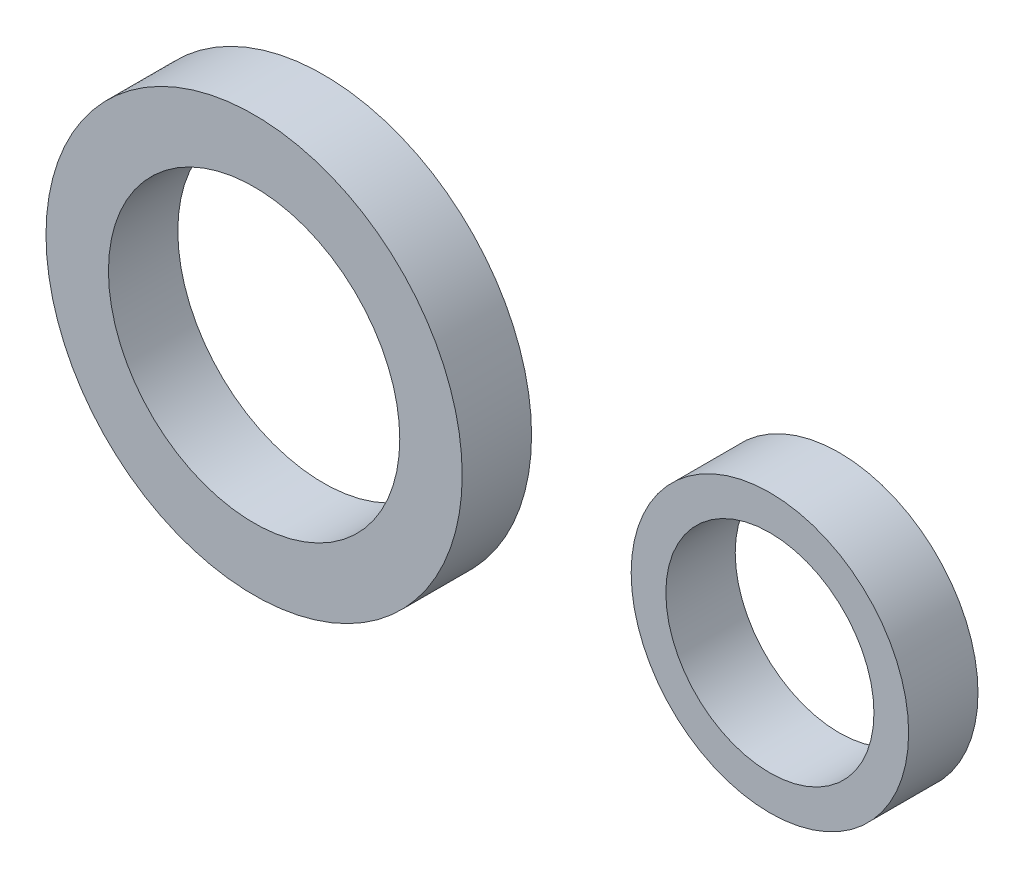
ISO-10303-21;
HEADER;
FILE_DESCRIPTION(('STEP AP214'),'2;1');
FILE_NAME('part.step','',(''),(''),'','','');
FILE_SCHEMA(('AUTOMOTIVE_DESIGN { 1 0 10303 214 1 1 1 1 }'));
ENDSEC;
DATA;
#1=APPLICATION_CONTEXT('core data for automotive mechanical design processes');
#2=APPLICATION_PROTOCOL_DEFINITION('international standard','automotive_design',2000,#1);
#3=PRODUCT_CONTEXT('',#1,'mechanical');
#4=PRODUCT('Part','Part','',(#3));
#5=PRODUCT_RELATED_PRODUCT_CATEGORY('part','',(#4));
#6=PRODUCT_DEFINITION_FORMATION('','',#4);
#7=PRODUCT_DEFINITION_CONTEXT('part definition',#1,'design');
#8=PRODUCT_DEFINITION('design','',#6,#7);
#9=PRODUCT_DEFINITION_SHAPE('','',#8);
#10=(LENGTH_UNIT() NAMED_UNIT(*) SI_UNIT(.MILLI.,.METRE.));
#11=(NAMED_UNIT(*) PLANE_ANGLE_UNIT() SI_UNIT($,.RADIAN.));
#12=(NAMED_UNIT(*) SI_UNIT($,.STERADIAN.) SOLID_ANGLE_UNIT());
#13=UNCERTAINTY_MEASURE_WITH_UNIT(LENGTH_MEASURE(1.E-05),#10,'distance_accuracy_value','');
#14=(GEOMETRIC_REPRESENTATION_CONTEXT(3) GLOBAL_UNCERTAINTY_ASSIGNED_CONTEXT((#13)) GLOBAL_UNIT_ASSIGNED_CONTEXT((#10,
#11,#12)) REPRESENTATION_CONTEXT('',''));
#15=CARTESIAN_POINT('',(0.,0.,0.));
#16=DIRECTION('',(0.,0.,1.));
#17=DIRECTION('',(1.,0.,0.));
#18=AXIS2_PLACEMENT_3D('',#15,#16,#17);
#19=CARTESIAN_POINT('',(37.1782422912576,0.,5.));
#20=DIRECTION('',(0.,0.,1.));
#21=DIRECTION('',(1.,0.,0.));
#22=AXIS2_PLACEMENT_3D('',#19,#20,#21);
#23=PLANE('',#22);
#24=CARTESIAN_POINT('',(37.1782422912576,0.,5.));
#25=DIRECTION('',(0.,0.,1.));
#26=DIRECTION('',(1.,0.,0.));
#27=AXIS2_PLACEMENT_3D('',#24,#25,#26);
#28=CIRCLE('',#27,10.);
#29=CARTESIAN_POINT('',(47.1782422912576,0.,5.));
#30=VERTEX_POINT('',#29);
#31=EDGE_CURVE('E12',#30,#30,#28,.T.);
#32=ORIENTED_EDGE('',*,*,#31,.T.);
#33=EDGE_LOOP('',(#32));
#34=FACE_BOUND('',#33,.T.);
#35=CARTESIAN_POINT('',(37.1782422912576,0.,5.));
#36=DIRECTION('',(0.,0.,1.));
#37=DIRECTION('',(1.,0.,0.));
#38=AXIS2_PLACEMENT_3D('',#35,#36,#37);
#39=CIRCLE('',#38,7.5);
#40=CARTESIAN_POINT('',(44.6782422912576,0.,5.));
#41=VERTEX_POINT('',#40);
#42=EDGE_CURVE('E58',#41,#41,#39,.T.);
#43=ORIENTED_EDGE('',*,*,#42,.F.);
#44=EDGE_LOOP('',(#43));
#45=FACE_BOUND('',#44,.T.);
#46=ADVANCED_FACE('F47',(#34,#45),#23,.T.);
#47=CARTESIAN_POINT('',(37.1782422912576,0.,0.));
#48=DIRECTION('',(0.,0.,1.));
#49=DIRECTION('',(1.,0.,0.));
#50=AXIS2_PLACEMENT_3D('',#47,#48,#49);
#51=PLANE('',#50);
#52=CARTESIAN_POINT('',(37.1782422912576,0.,0.));
#53=DIRECTION('',(0.,0.,1.));
#54=DIRECTION('',(1.,0.,0.));
#55=AXIS2_PLACEMENT_3D('',#52,#53,#54);
#56=CIRCLE('',#55,10.);
#57=CARTESIAN_POINT('',(47.1782422912576,0.,0.));
#58=VERTEX_POINT('',#57);
#59=EDGE_CURVE('E51',#58,#58,#56,.T.);
#60=ORIENTED_EDGE('',*,*,#59,.F.);
#61=EDGE_LOOP('',(#60));
#62=FACE_BOUND('',#61,.T.);
#63=CARTESIAN_POINT('',(37.1782422912576,0.,0.));
#64=DIRECTION('',(0.,0.,1.));
#65=DIRECTION('',(1.,0.,0.));
#66=AXIS2_PLACEMENT_3D('',#63,#64,#65);
#67=CIRCLE('',#66,7.5);
#68=CARTESIAN_POINT('',(44.6782422912576,0.,0.));
#69=VERTEX_POINT('',#68);
#70=EDGE_CURVE('E60',#69,#69,#67,.T.);
#71=ORIENTED_EDGE('',*,*,#70,.T.);
#72=EDGE_LOOP('',(#71));
#73=FACE_BOUND('',#72,.T.);
#74=ADVANCED_FACE('F70',(#62,#73),#51,.F.);
#75=CARTESIAN_POINT('',(37.1782422912576,0.,5.));
#76=DIRECTION('',(0.,0.,-1.));
#77=DIRECTION('',(-1.,0.,0.));
#78=AXIS2_PLACEMENT_3D('',#75,#76,#77);
#79=CYLINDRICAL_SURFACE('',#78,10.);
#80=ORIENTED_EDGE('',*,*,#31,.F.);
#81=EDGE_LOOP('',(#80));
#82=FACE_BOUND('',#81,.T.);
#83=ORIENTED_EDGE('',*,*,#59,.T.);
#84=EDGE_LOOP('',(#83));
#85=FACE_BOUND('',#84,.T.);
#86=ADVANCED_FACE('F49',(#82,#85),#79,.T.);
#87=CARTESIAN_POINT('',(37.1782422912576,0.,5.));
#88=DIRECTION('',(0.,0.,-1.));
#89=DIRECTION('',(-1.,0.,0.));
#90=AXIS2_PLACEMENT_3D('',#87,#88,#89);
#91=CYLINDRICAL_SURFACE('',#90,7.5);
#92=ORIENTED_EDGE('',*,*,#42,.T.);
#93=EDGE_LOOP('',(#92));
#94=FACE_BOUND('',#93,.T.);
#95=ORIENTED_EDGE('',*,*,#70,.F.);
#96=EDGE_LOOP('',(#95));
#97=FACE_BOUND('',#96,.T.);
#98=ADVANCED_FACE('F66',(#94,#97),#91,.F.);
#99=CLOSED_SHELL('',(#46,#74,#86,#98));
#100=MANIFOLD_SOLID_BREP('B2',#99);
#101=CARTESIAN_POINT('',(0.,0.,5.));
#102=DIRECTION('',(0.,0.,1.));
#103=DIRECTION('',(1.,0.,0.));
#104=AXIS2_PLACEMENT_3D('',#101,#102,#103);
#105=PLANE('',#104);
#106=CARTESIAN_POINT('',(0.,0.,5.));
#107=DIRECTION('',(0.,0.,1.));
#108=DIRECTION('',(1.,0.,0.));
#109=AXIS2_PLACEMENT_3D('',#106,#107,#108);
#110=CIRCLE('',#109,15.);
#111=CARTESIAN_POINT('',(15.,0.,5.));
#112=VERTEX_POINT('',#111);
#113=EDGE_CURVE('E46',#112,#112,#110,.T.);
#114=ORIENTED_EDGE('',*,*,#113,.T.);
#115=EDGE_LOOP('',(#114));
#116=FACE_BOUND('',#115,.T.);
#117=CARTESIAN_POINT('',(0.,0.,5.));
#118=DIRECTION('',(0.,0.,1.));
#119=DIRECTION('',(1.,0.,0.));
#120=AXIS2_PLACEMENT_3D('',#117,#118,#119);
#121=CIRCLE('',#120,10.5);
#122=CARTESIAN_POINT('',(10.5,0.,5.));
#123=VERTEX_POINT('',#122);
#124=EDGE_CURVE('E120',#123,#123,#121,.T.);
#125=ORIENTED_EDGE('',*,*,#124,.F.);
#126=EDGE_LOOP('',(#125));
#127=FACE_BOUND('',#126,.T.);
#128=ADVANCED_FACE('F109',(#116,#127),#105,.T.);
#129=CARTESIAN_POINT('',(0.,0.,0.));
#130=DIRECTION('',(0.,0.,1.));
#131=DIRECTION('',(1.,0.,0.));
#132=AXIS2_PLACEMENT_3D('',#129,#130,#131);
#133=PLANE('',#132);
#134=CARTESIAN_POINT('',(0.,0.,0.));
#135=DIRECTION('',(0.,0.,1.));
#136=DIRECTION('',(1.,0.,0.));
#137=AXIS2_PLACEMENT_3D('',#134,#135,#136);
#138=CIRCLE('',#137,15.);
#139=CARTESIAN_POINT('',(15.,0.,0.));
#140=VERTEX_POINT('',#139);
#141=EDGE_CURVE('E113',#140,#140,#138,.T.);
#142=ORIENTED_EDGE('',*,*,#141,.F.);
#143=EDGE_LOOP('',(#142));
#144=FACE_BOUND('',#143,.T.);
#145=CARTESIAN_POINT('',(0.,0.,0.));
#146=DIRECTION('',(0.,0.,1.));
#147=DIRECTION('',(1.,0.,0.));
#148=AXIS2_PLACEMENT_3D('',#145,#146,#147);
#149=CIRCLE('',#148,10.5);
#150=CARTESIAN_POINT('',(10.5,0.,0.));
#151=VERTEX_POINT('',#150);
#152=EDGE_CURVE('E122',#151,#151,#149,.T.);
#153=ORIENTED_EDGE('',*,*,#152,.T.);
#154=EDGE_LOOP('',(#153));
#155=FACE_BOUND('',#154,.T.);
#156=ADVANCED_FACE('F132',(#144,#155),#133,.F.);
#157=CARTESIAN_POINT('',(0.,0.,5.));
#158=DIRECTION('',(0.,0.,-1.));
#159=DIRECTION('',(-1.,0.,0.));
#160=AXIS2_PLACEMENT_3D('',#157,#158,#159);
#161=CYLINDRICAL_SURFACE('',#160,15.);
#162=ORIENTED_EDGE('',*,*,#113,.F.);
#163=EDGE_LOOP('',(#162));
#164=FACE_BOUND('',#163,.T.);
#165=ORIENTED_EDGE('',*,*,#141,.T.);
#166=EDGE_LOOP('',(#165));
#167=FACE_BOUND('',#166,.T.);
#168=ADVANCED_FACE('F111',(#164,#167),#161,.T.);
#169=CARTESIAN_POINT('',(0.,0.,5.));
#170=DIRECTION('',(0.,0.,-1.));
#171=DIRECTION('',(-1.,0.,0.));
#172=AXIS2_PLACEMENT_3D('',#169,#170,#171);
#173=CYLINDRICAL_SURFACE('',#172,10.5);
#174=ORIENTED_EDGE('',*,*,#124,.T.);
#175=EDGE_LOOP('',(#174));
#176=FACE_BOUND('',#175,.T.);
#177=ORIENTED_EDGE('',*,*,#152,.F.);
#178=EDGE_LOOP('',(#177));
#179=FACE_BOUND('',#178,.T.);
#180=ADVANCED_FACE('F128',(#176,#179),#173,.F.);
#181=CLOSED_SHELL('',(#128,#156,#168,#180));
#182=MANIFOLD_SOLID_BREP('B7',#181);
#183=ADVANCED_BREP_SHAPE_REPRESENTATION('',(#18,#100,#182),#14);
#184=SHAPE_DEFINITION_REPRESENTATION(#9,#183);
ENDSEC;
END-ISO-10303-21;
